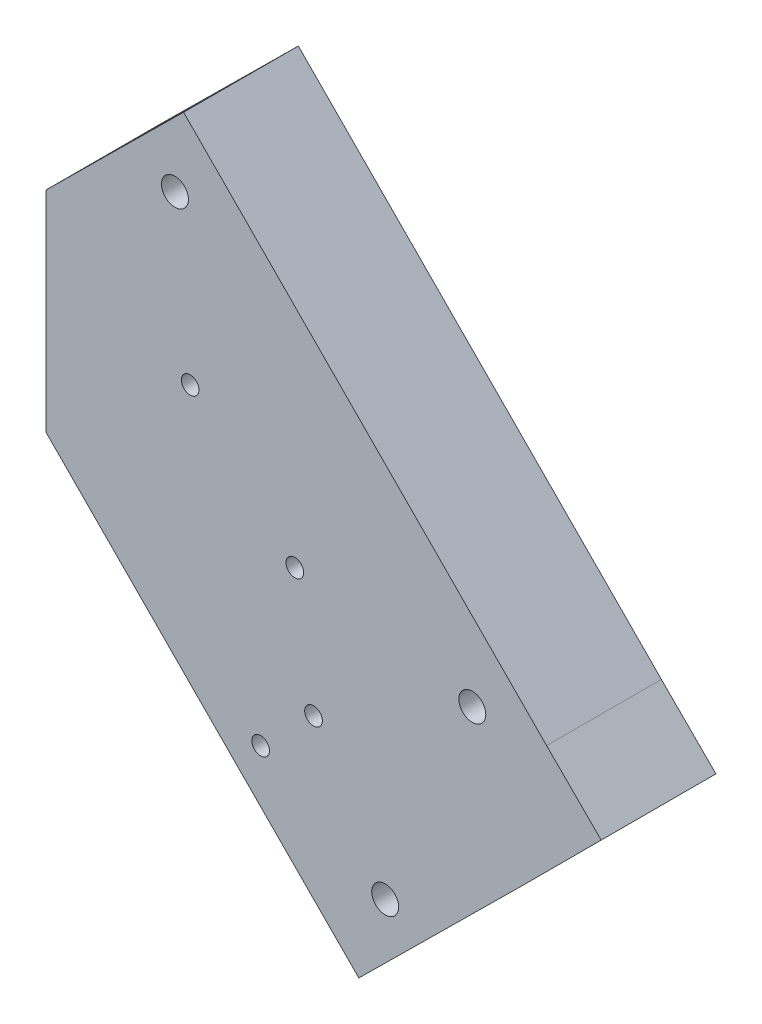
ISO-10303-21;
HEADER;
FILE_DESCRIPTION(('STEP AP214'),'2;1');
FILE_NAME('part.step','',(''),(''),'','','');
FILE_SCHEMA(('AUTOMOTIVE_DESIGN { 1 0 10303 214 1 1 1 1 }'));
ENDSEC;
DATA;
#1=APPLICATION_CONTEXT('core data for automotive mechanical design processes');
#2=APPLICATION_PROTOCOL_DEFINITION('international standard','automotive_design',2000,#1);
#3=PRODUCT_CONTEXT('',#1,'mechanical');
#4=PRODUCT('Part','Part','',(#3));
#5=PRODUCT_RELATED_PRODUCT_CATEGORY('part','',(#4));
#6=PRODUCT_DEFINITION_FORMATION('','',#4);
#7=PRODUCT_DEFINITION_CONTEXT('part definition',#1,'design');
#8=PRODUCT_DEFINITION('design','',#6,#7);
#9=PRODUCT_DEFINITION_SHAPE('','',#8);
#10=(LENGTH_UNIT() NAMED_UNIT(*) SI_UNIT(.MILLI.,.METRE.));
#11=(NAMED_UNIT(*) PLANE_ANGLE_UNIT() SI_UNIT($,.RADIAN.));
#12=(NAMED_UNIT(*) SI_UNIT($,.STERADIAN.) SOLID_ANGLE_UNIT());
#13=UNCERTAINTY_MEASURE_WITH_UNIT(LENGTH_MEASURE(1.E-05),#10,'distance_accuracy_value','');
#14=(GEOMETRIC_REPRESENTATION_CONTEXT(3) GLOBAL_UNCERTAINTY_ASSIGNED_CONTEXT((#13)) GLOBAL_UNIT_ASSIGNED_CONTEXT((#10,
#11,#12)) REPRESENTATION_CONTEXT('',''));
#15=CARTESIAN_POINT('',(0.,0.,0.));
#16=DIRECTION('',(0.,0.,1.));
#17=DIRECTION('',(1.,0.,0.));
#18=AXIS2_PLACEMENT_3D('',#15,#16,#17);
#19=CARTESIAN_POINT('',(-16.51,0.,129.532503117749));
#20=DIRECTION('',(-1.,0.,0.));
#21=DIRECTION('',(0.,0.,1.));
#22=AXIS2_PLACEMENT_3D('',#19,#20,#21);
#23=PLANE('',#22);
#24=DIRECTION('',(0.,1.,0.));
#25=VECTOR('',#24,1.);
#26=CARTESIAN_POINT('',(-16.51,0.,0.));
#27=LINE('',#26,#25);
#28=CARTESIAN_POINT('',(-16.51,3.14621411463105,0.));
#29=VERTEX_POINT('',#28);
#30=CARTESIAN_POINT('',(-16.51,30.0469418693277,0.));
#31=VERTEX_POINT('',#30);
#32=EDGE_CURVE('E163',#29,#31,#27,.T.);
#33=ORIENTED_EDGE('',*,*,#32,.F.);
#34=DIRECTION('',(0.,0.,1.));
#35=VECTOR('',#34,1.);
#36=CARTESIAN_POINT('',(-16.51,3.14621411463105,129.532503117749));
#37=LINE('',#36,#35);
#38=CARTESIAN_POINT('',(-16.51,3.14621411463105,14.7027999700007));
#39=VERTEX_POINT('',#38);
#40=EDGE_CURVE('E159',#29,#39,#37,.T.);
#41=ORIENTED_EDGE('',*,*,#40,.T.);
#42=DIRECTION('',(0.,1.,0.));
#43=VECTOR('',#42,1.);
#44=CARTESIAN_POINT('',(-16.51,0.,14.7027999700007));
#45=LINE('',#44,#43);
#46=CARTESIAN_POINT('',(-16.51,30.0469418693277,14.7027999700007));
#47=VERTEX_POINT('',#46);
#48=EDGE_CURVE('E162',#39,#47,#45,.T.);
#49=ORIENTED_EDGE('',*,*,#48,.T.);
#50=DIRECTION('',(0.,0.,1.));
#51=VECTOR('',#50,1.);
#52=CARTESIAN_POINT('',(-16.51,30.0469418693277,129.532503117749));
#53=LINE('',#52,#51);
#54=EDGE_CURVE('E157',#31,#47,#53,.T.);
#55=ORIENTED_EDGE('',*,*,#54,.F.);
#56=EDGE_LOOP('',(#33,#41,#49,#55));
#57=FACE_BOUND('',#56,.T.);
#58=ADVANCED_FACE('F17',(#57),#23,.T.);
#59=CARTESIAN_POINT('',(0.,0.,0.));
#60=DIRECTION('',(0.,0.,1.));
#61=DIRECTION('',(1.,0.,0.));
#62=AXIS2_PLACEMENT_3D('',#59,#60,#61);
#63=PLANE('',#62);
#64=CARTESIAN_POINT('',(2.65936880940541E-13,38.1,0.));
#65=DIRECTION('',(0.,0.,1.));
#66=DIRECTION('',(1.,0.,0.));
#67=AXIS2_PLACEMENT_3D('',#64,#65,#66);
#68=CIRCLE('',#67,1.7272);
#69=CARTESIAN_POINT('',(1.72720000000027,38.1,0.));
#70=VERTEX_POINT('',#69);
#71=EDGE_CURVE('E166',#70,#70,#68,.T.);
#72=ORIENTED_EDGE('',*,*,#71,.T.);
#73=EDGE_LOOP('',(#72));
#74=FACE_BOUND('',#73,.T.);
#75=CARTESIAN_POINT('',(38.0999999999975,-1.26008841324518E-13,0.));
#76=DIRECTION('',(0.,0.,1.));
#77=DIRECTION('',(1.,0.,0.));
#78=AXIS2_PLACEMENT_3D('',#75,#76,#77);
#79=CIRCLE('',#78,1.7272);
#80=CARTESIAN_POINT('',(39.8271999999975,-1.26008841324518E-13,0.));
#81=VERTEX_POINT('',#80);
#82=EDGE_CURVE('E169',#81,#81,#79,.T.);
#83=ORIENTED_EDGE('',*,*,#82,.T.);
#84=EDGE_LOOP('',(#83));
#85=FACE_BOUND('',#84,.T.);
#86=CARTESIAN_POINT('',(26.9407683632053,-26.9407683632067,0.));
#87=DIRECTION('',(0.,0.,1.));
#88=DIRECTION('',(1.,0.,0.));
#89=AXIS2_PLACEMENT_3D('',#86,#87,#88);
#90=CIRCLE('',#89,1.72719999999997);
#91=CARTESIAN_POINT('',(28.6679683632052,-26.9407683632067,0.));
#92=VERTEX_POINT('',#91);
#93=EDGE_CURVE('E172',#92,#92,#90,.T.);
#94=ORIENTED_EDGE('',*,*,#93,.T.);
#95=EDGE_LOOP('',(#94));
#96=FACE_BOUND('',#95,.T.);
#97=DIRECTION('',(0.703254513464339,-0.710938175435836,0.));
#98=VECTOR('',#97,1.);
#99=CARTESIAN_POINT('',(1.10857066830999,47.4750949371857,0.));
#100=LINE('',#99,#98);
#101=CARTESIAN_POINT('',(1.10857066830999,47.4750949371857,0.));
#102=VERTEX_POINT('',#101);
#103=CARTESIAN_POINT('',(47.6228492556575,0.452607747304518,0.));
#104=VERTEX_POINT('',#103);
#105=EDGE_CURVE('E144',#102,#104,#100,.T.);
#106=ORIENTED_EDGE('',*,*,#105,.T.);
#107=DIRECTION('',(0.707106781186557,-0.707106781186539,0.));
#108=VECTOR('',#107,1.);
#109=CARTESIAN_POINT('',(47.6228492556575,0.452607747304507,0.));
#110=LINE('',#109,#108);
#111=CARTESIAN_POINT('',(54.612214911514,-6.53675790855186,0.));
#112=VERTEX_POINT('',#111);
#113=EDGE_CURVE('E98',#104,#112,#110,.T.);
#114=ORIENTED_EDGE('',*,*,#113,.T.);
#115=DIRECTION('',(-0.707106781186539,-0.707106781186557,0.));
#116=VECTOR('',#115,1.);
#117=CARTESIAN_POINT('',(44.6908277654517,-16.4581450546145,0.));
#118=LINE('',#117,#116);
#119=CARTESIAN_POINT('',(44.6908277654517,-16.4581450546145,0.));
#120=VERTEX_POINT('',#119);
#121=EDGE_CURVE('E94',#112,#120,#118,.T.);
#122=ORIENTED_EDGE('',*,*,#121,.T.);
#123=DIRECTION('',(0.710938175435836,0.703254513464339,0.));
#124=VECTOR('',#123,1.);
#125=CARTESIAN_POINT('',(23.559505197792,-37.3610849791266,0.));
#126=LINE('',#125,#124);
#127=CARTESIAN_POINT('',(23.559505197792,-37.3610849791266,0.));
#128=VERTEX_POINT('',#127);
#129=EDGE_CURVE('E141',#128,#120,#126,.T.);
#130=ORIENTED_EDGE('',*,*,#129,.F.);
#131=DIRECTION('',(0.70325451346434,-0.710938175435836,0.));
#132=VECTOR('',#131,1.);
#133=CARTESIAN_POINT('',(-29.9595697858711,16.7427320478914,0.));
#134=LINE('',#133,#132);
#135=EDGE_CURVE('E139',#29,#128,#134,.T.);
#136=ORIENTED_EDGE('',*,*,#135,.F.);
#137=ORIENTED_EDGE('',*,*,#32,.T.);
#138=DIRECTION('',(0.710938175435836,0.70325451346434,0.));
#139=VECTOR('',#138,1.);
#140=CARTESIAN_POINT('',(-29.9595697858711,16.7427320478914,0.));
#141=LINE('',#140,#139);
#142=EDGE_CURVE('E147',#31,#102,#141,.T.);
#143=ORIENTED_EDGE('',*,*,#142,.T.);
#144=EDGE_LOOP('',(#106,#114,#122,#130,#136,#137,#143));
#145=FACE_BOUND('',#144,.T.);
#146=ADVANCED_FACE('F195',(#74,#85,#96,#145),#63,.F.);
#147=CARTESIAN_POINT('',(33.67649573755,8.86349599743227,14.7027999700008));
#148=DIRECTION('',(0.,0.,1.));
#149=DIRECTION('',(-0.703254513464339,0.710938175435836,0.));
#150=AXIS2_PLACEMENT_3D('',#147,#148,#149);
#151=PLANE('',#150);
#152=DIRECTION('',(0.710938175435836,0.703254513464339,0.));
#153=VECTOR('',#152,1.);
#154=CARTESIAN_POINT('',(23.559505197792,-37.3610849791266,14.7027999700007));
#155=LINE('',#154,#153);
#156=CARTESIAN_POINT('',(23.559505197792,-37.3610849791266,14.7027999700007));
#157=VERTEX_POINT('',#156);
#158=CARTESIAN_POINT('',(44.6908277654517,-16.4581450546145,14.7027999700008));
#159=VERTEX_POINT('',#158);
#160=EDGE_CURVE('E106',#157,#159,#155,.T.);
#161=ORIENTED_EDGE('',*,*,#160,.T.);
#162=DIRECTION('',(0.707106781186539,0.707106781186556,0.));
#163=VECTOR('',#162,1.);
#164=CARTESIAN_POINT('',(44.6908277654517,-16.4581450546145,14.7027999700007));
#165=LINE('',#164,#163);
#166=CARTESIAN_POINT('',(54.612214911514,-6.53675790855186,14.7027999700007));
#167=VERTEX_POINT('',#166);
#168=EDGE_CURVE('E92',#159,#167,#165,.T.);
#169=ORIENTED_EDGE('',*,*,#168,.T.);
#170=DIRECTION('',(-0.707106781186557,0.707106781186539,0.));
#171=VECTOR('',#170,1.);
#172=CARTESIAN_POINT('',(47.6228492556575,0.452607747304507,14.7027999700007));
#173=LINE('',#172,#171);
#174=CARTESIAN_POINT('',(47.6228492556575,0.452607747304507,14.7027999700007));
#175=VERTEX_POINT('',#174);
#176=EDGE_CURVE('E99',#167,#175,#173,.T.);
#177=ORIENTED_EDGE('',*,*,#176,.T.);
#178=DIRECTION('',(0.703254513464339,-0.710938175435836,0.));
#179=VECTOR('',#178,1.);
#180=CARTESIAN_POINT('',(1.10857066830999,47.4750949371857,14.7027999700007));
#181=LINE('',#180,#179);
#182=CARTESIAN_POINT('',(1.10857066830999,47.4750949371857,14.7027999700008));
#183=VERTEX_POINT('',#182);
#184=EDGE_CURVE('E142',#183,#175,#181,.T.);
#185=ORIENTED_EDGE('',*,*,#184,.F.);
#186=DIRECTION('',(0.710938175435836,0.70325451346434,0.));
#187=VECTOR('',#186,1.);
#188=CARTESIAN_POINT('',(-1.73518203343335,44.6620768833284,14.7027999700008));
#189=LINE('',#188,#187);
#190=EDGE_CURVE('E11',#47,#183,#189,.T.);
#191=ORIENTED_EDGE('',*,*,#190,.F.);
#192=ORIENTED_EDGE('',*,*,#48,.F.);
#193=DIRECTION('',(0.70325451346434,-0.710938175435836,0.));
#194=VECTOR('',#193,1.);
#195=CARTESIAN_POINT('',(5.45210798511224,-19.0558488380047,14.7027999700007));
#196=LINE('',#195,#194);
#197=EDGE_CURVE('E25',#39,#157,#196,.T.);
#198=ORIENTED_EDGE('',*,*,#197,.T.);
#199=EDGE_LOOP('',(#161,#169,#177,#185,#191,#192,#198));
#200=FACE_BOUND('',#199,.T.);
#201=CARTESIAN_POINT('',(17.753156923691,-11.1750395356113,14.7027999700007));
#202=DIRECTION('',(0.,0.,1.));
#203=DIRECTION('',(1.,0.,0.));
#204=AXIS2_PLACEMENT_3D('',#201,#202,#203);
#205=CIRCLE('',#204,1.13029999999999);
#206=CARTESIAN_POINT('',(18.883456923691,-11.1750395356113,14.7027999700007));
#207=VERTEX_POINT('',#206);
#208=EDGE_CURVE('E115',#207,#207,#205,.T.);
#209=ORIENTED_EDGE('',*,*,#208,.F.);
#210=EDGE_LOOP('',(#209));
#211=FACE_BOUND('',#210,.T.);
#212=CARTESIAN_POINT('',(10.9814708026647,-17.8735387763591,14.7027999700007));
#213=DIRECTION('',(0.,0.,1.));
#214=DIRECTION('',(1.,0.,0.));
#215=AXIS2_PLACEMENT_3D('',#212,#213,#214);
#216=CIRCLE('',#215,1.1303);
#217=CARTESIAN_POINT('',(12.1117708026647,-17.8735387763591,14.7027999700007));
#218=VERTEX_POINT('',#217);
#219=EDGE_CURVE('E121',#218,#218,#216,.T.);
#220=ORIENTED_EDGE('',*,*,#219,.F.);
#221=EDGE_LOOP('',(#220));
#222=FACE_BOUND('',#221,.T.);
#223=CARTESIAN_POINT('',(15.3652146717453,4.07886797903757,14.7027999700007));
#224=DIRECTION('',(0.,0.,1.));
#225=DIRECTION('',(1.,0.,0.));
#226=AXIS2_PLACEMENT_3D('',#223,#224,#225);
#227=CIRCLE('',#226,1.1303);
#228=CARTESIAN_POINT('',(16.4955146717453,4.07886797903757,14.7027999700007));
#229=VERTEX_POINT('',#228);
#230=EDGE_CURVE('E127',#229,#229,#227,.T.);
#231=ORIENTED_EDGE('',*,*,#230,.F.);
#232=EDGE_LOOP('',(#231));
#233=FACE_BOUND('',#232,.T.);
#234=CARTESIAN_POINT('',(1.95035352560764,17.6402980507463,14.7027999700007));
#235=DIRECTION('',(0.,0.,1.));
#236=DIRECTION('',(1.,0.,0.));
#237=AXIS2_PLACEMENT_3D('',#234,#235,#236);
#238=CIRCLE('',#237,1.1303);
#239=CARTESIAN_POINT('',(3.08065352560764,17.6402980507463,14.7027999700007));
#240=VERTEX_POINT('',#239);
#241=EDGE_CURVE('E133',#240,#240,#238,.T.);
#242=ORIENTED_EDGE('',*,*,#241,.F.);
#243=EDGE_LOOP('',(#242));
#244=FACE_BOUND('',#243,.T.);
#245=CARTESIAN_POINT('',(26.9407683632053,-26.9407683632067,14.7027999700007));
#246=DIRECTION('',(0.,0.,1.));
#247=DIRECTION('',(1.,0.,0.));
#248=AXIS2_PLACEMENT_3D('',#245,#246,#247);
#249=CIRCLE('',#248,1.72719999999997);
#250=CARTESIAN_POINT('',(28.6679683632052,-26.9407683632067,14.7027999700007));
#251=VERTEX_POINT('',#250);
#252=EDGE_CURVE('E175',#251,#251,#249,.T.);
#253=ORIENTED_EDGE('',*,*,#252,.F.);
#254=EDGE_LOOP('',(#253));
#255=FACE_BOUND('',#254,.T.);
#256=CARTESIAN_POINT('',(38.0999999999975,-1.26008841324518E-13,14.7027999700008));
#257=DIRECTION('',(0.,0.,1.));
#258=DIRECTION('',(1.,0.,0.));
#259=AXIS2_PLACEMENT_3D('',#256,#257,#258);
#260=CIRCLE('',#259,1.7272);
#261=CARTESIAN_POINT('',(39.8271999999975,-1.26008841324518E-13,14.7027999700008));
#262=VERTEX_POINT('',#261);
#263=EDGE_CURVE('E178',#262,#262,#260,.T.);
#264=ORIENTED_EDGE('',*,*,#263,.F.);
#265=EDGE_LOOP('',(#264));
#266=FACE_BOUND('',#265,.T.);
#267=CARTESIAN_POINT('',(2.65936880940541E-13,38.1,14.7027999700007));
#268=DIRECTION('',(0.,0.,1.));
#269=DIRECTION('',(1.,0.,0.));
#270=AXIS2_PLACEMENT_3D('',#267,#268,#269);
#271=CIRCLE('',#270,1.7272);
#272=CARTESIAN_POINT('',(1.72720000000027,38.1,14.7027999700007));
#273=VERTEX_POINT('',#272);
#274=EDGE_CURVE('E181',#273,#273,#271,.T.);
#275=ORIENTED_EDGE('',*,*,#274,.F.);
#276=EDGE_LOOP('',(#275));
#277=FACE_BOUND('',#276,.T.);
#278=ADVANCED_FACE('F19',(#200,#211,#222,#233,#244,#255,#266,#277),#151,.T.);
#279=CARTESIAN_POINT('',(2.65936880940541E-13,38.1,129.532503117749));
#280=DIRECTION('',(0.,0.,-1.));
#281=DIRECTION('',(-1.,0.,0.));
#282=AXIS2_PLACEMENT_3D('',#279,#280,#281);
#283=CYLINDRICAL_SURFACE('',#282,1.7272);
#284=ORIENTED_EDGE('',*,*,#71,.F.);
#285=EDGE_LOOP('',(#284));
#286=FACE_BOUND('',#285,.T.);
#287=ORIENTED_EDGE('',*,*,#274,.T.);
#288=EDGE_LOOP('',(#287));
#289=FACE_BOUND('',#288,.T.);
#290=ADVANCED_FACE('F229',(#286,#289),#283,.F.);
#291=CARTESIAN_POINT('',(38.0999999999975,-1.26008841324518E-13,129.532503117749));
#292=DIRECTION('',(0.,0.,-1.));
#293=DIRECTION('',(-1.,0.,0.));
#294=AXIS2_PLACEMENT_3D('',#291,#292,#293);
#295=CYLINDRICAL_SURFACE('',#294,1.7272);
#296=ORIENTED_EDGE('',*,*,#82,.F.);
#297=EDGE_LOOP('',(#296));
#298=FACE_BOUND('',#297,.T.);
#299=ORIENTED_EDGE('',*,*,#263,.T.);
#300=EDGE_LOOP('',(#299));
#301=FACE_BOUND('',#300,.T.);
#302=ADVANCED_FACE('F225',(#298,#301),#295,.F.);
#303=CARTESIAN_POINT('',(26.9407683632053,-26.9407683632067,129.532503117749));
#304=DIRECTION('',(0.,0.,-1.));
#305=DIRECTION('',(-1.,0.,0.));
#306=AXIS2_PLACEMENT_3D('',#303,#304,#305);
#307=CYLINDRICAL_SURFACE('',#306,1.72719999999997);
#308=ORIENTED_EDGE('',*,*,#93,.F.);
#309=EDGE_LOOP('',(#308));
#310=FACE_BOUND('',#309,.T.);
#311=ORIENTED_EDGE('',*,*,#252,.T.);
#312=EDGE_LOOP('',(#311));
#313=FACE_BOUND('',#312,.T.);
#314=ADVANCED_FACE('F222',(#310,#313),#307,.F.);
#315=CARTESIAN_POINT('',(23.559505197792,-37.3610849791266,0.));
#316=DIRECTION('',(0.703254513464339,-0.710938175435836,0.));
#317=DIRECTION('',(0.710938175435836,0.703254513464339,0.));
#318=AXIS2_PLACEMENT_3D('',#315,#316,#317);
#319=PLANE('',#318);
#320=DIRECTION('',(0.,0.,-1.));
#321=VECTOR('',#320,1.);
#322=CARTESIAN_POINT('',(44.6908277654517,-16.4581450546145,129.532503117749));
#323=LINE('',#322,#321);
#324=EDGE_CURVE('E39',#120,#159,#323,.F.);
#325=ORIENTED_EDGE('',*,*,#324,.T.);
#326=ORIENTED_EDGE('',*,*,#160,.F.);
#327=DIRECTION('',(0.,0.,1.));
#328=VECTOR('',#327,1.);
#329=CARTESIAN_POINT('',(23.559505197792,-37.3610849791266,0.));
#330=LINE('',#329,#328);
#331=EDGE_CURVE('E150',#128,#157,#330,.T.);
#332=ORIENTED_EDGE('',*,*,#331,.F.);
#333=ORIENTED_EDGE('',*,*,#129,.T.);
#334=EDGE_LOOP('',(#325,#326,#332,#333));
#335=FACE_BOUND('',#334,.T.);
#336=ADVANCED_FACE('F197',(#335),#319,.T.);
#337=CARTESIAN_POINT('',(-29.9595697858711,16.7427320478914,0.));
#338=DIRECTION('',(-0.710938175435836,-0.703254513464339,0.));
#339=DIRECTION('',(0.70325451346434,-0.710938175435836,0.));
#340=AXIS2_PLACEMENT_3D('',#337,#338,#339);
#341=PLANE('',#340);
#342=ORIENTED_EDGE('',*,*,#135,.T.);
#343=ORIENTED_EDGE('',*,*,#331,.T.);
#344=ORIENTED_EDGE('',*,*,#197,.F.);
#345=ORIENTED_EDGE('',*,*,#40,.F.);
#346=EDGE_LOOP('',(#342,#343,#344,#345));
#347=FACE_BOUND('',#346,.T.);
#348=ADVANCED_FACE('F188',(#347),#341,.T.);
#349=CARTESIAN_POINT('',(1.10857066830999,47.4750949371857,0.));
#350=DIRECTION('',(-0.710938175435836,-0.703254513464339,0.));
#351=DIRECTION('',(0.70325451346434,-0.710938175435836,0.));
#352=AXIS2_PLACEMENT_3D('',#349,#350,#351);
#353=PLANE('',#352);
#354=ORIENTED_EDGE('',*,*,#105,.F.);
#355=DIRECTION('',(0.,0.,1.));
#356=VECTOR('',#355,1.);
#357=CARTESIAN_POINT('',(1.10857066830999,47.4750949371857,0.));
#358=LINE('',#357,#356);
#359=EDGE_CURVE('E32',#102,#183,#358,.T.);
#360=ORIENTED_EDGE('',*,*,#359,.T.);
#361=ORIENTED_EDGE('',*,*,#184,.T.);
#362=DIRECTION('',(0.,0.,-1.));
#363=VECTOR('',#362,1.);
#364=CARTESIAN_POINT('',(47.6228492556575,0.452607747304518,129.532503117749));
#365=LINE('',#364,#363);
#366=EDGE_CURVE('E110',#104,#175,#365,.F.);
#367=ORIENTED_EDGE('',*,*,#366,.F.);
#368=EDGE_LOOP('',(#354,#360,#361,#367));
#369=FACE_BOUND('',#368,.T.);
#370=ADVANCED_FACE('F198',(#369),#353,.F.);
#371=CARTESIAN_POINT('',(-29.9595697858711,16.7427320478914,0.));
#372=DIRECTION('',(0.703254513464339,-0.710938175435836,0.));
#373=DIRECTION('',(0.710938175435836,0.70325451346434,0.));
#374=AXIS2_PLACEMENT_3D('',#371,#372,#373);
#375=PLANE('',#374);
#376=ORIENTED_EDGE('',*,*,#54,.T.);
#377=ORIENTED_EDGE('',*,*,#190,.T.);
#378=ORIENTED_EDGE('',*,*,#359,.F.);
#379=ORIENTED_EDGE('',*,*,#142,.F.);
#380=EDGE_LOOP('',(#376,#377,#378,#379));
#381=FACE_BOUND('',#380,.T.);
#382=ADVANCED_FACE('F200',(#381),#375,.F.);
#383=CARTESIAN_POINT('',(1.95035352560764,17.6402980507463,2.00279997000074));
#384=DIRECTION('',(0.,0.,1.));
#385=DIRECTION('',(1.,0.,0.));
#386=AXIS2_PLACEMENT_3D('',#383,#384,#385);
#387=CONICAL_SURFACE('',#386,1.1303,1.02974425867665);
#388=CARTESIAN_POINT('',(1.95035352560763,17.6402980507463,1.32364721231389));
#389=VERTEX_POINT('',#388);
#390=VERTEX_LOOP('',#389);
#391=FACE_BOUND('',#390,.T.);
#392=CARTESIAN_POINT('',(1.95035352560764,17.6402980507463,2.00279997000074));
#393=DIRECTION('',(0.,0.,1.));
#394=DIRECTION('',(1.,0.,0.));
#395=AXIS2_PLACEMENT_3D('',#392,#393,#394);
#396=CIRCLE('',#395,1.1303);
#397=CARTESIAN_POINT('',(3.08065352560764,17.6402980507463,2.00279997000074));
#398=VERTEX_POINT('',#397);
#399=EDGE_CURVE('E136',#398,#398,#396,.T.);
#400=ORIENTED_EDGE('',*,*,#399,.T.);
#401=EDGE_LOOP('',(#400));
#402=FACE_BOUND('',#401,.T.);
#403=ADVANCED_FACE('F202',(#391,#402),#387,.F.);
#404=CARTESIAN_POINT('',(1.95035352560764,17.6402980507463,14.7027999700007));
#405=DIRECTION('',(0.,0.,1.));
#406=DIRECTION('',(1.,0.,0.));
#407=AXIS2_PLACEMENT_3D('',#404,#405,#406);
#408=CYLINDRICAL_SURFACE('',#407,1.1303);
#409=ORIENTED_EDGE('',*,*,#399,.F.);
#410=EDGE_LOOP('',(#409));
#411=FACE_BOUND('',#410,.T.);
#412=ORIENTED_EDGE('',*,*,#241,.T.);
#413=EDGE_LOOP('',(#412));
#414=FACE_BOUND('',#413,.T.);
#415=ADVANCED_FACE('F210',(#411,#414),#408,.F.);
#416=CARTESIAN_POINT('',(15.3652146717453,4.07886797903757,2.00279997000074));
#417=DIRECTION('',(0.,0.,1.));
#418=DIRECTION('',(1.,0.,0.));
#419=AXIS2_PLACEMENT_3D('',#416,#417,#418);
#420=CONICAL_SURFACE('',#419,1.1303,1.02974425867665);
#421=CARTESIAN_POINT('',(15.3652146717453,4.07886797903757,1.32364721231389));
#422=VERTEX_POINT('',#421);
#423=VERTEX_LOOP('',#422);
#424=FACE_BOUND('',#423,.T.);
#425=CARTESIAN_POINT('',(15.3652146717453,4.07886797903757,2.00279997000074));
#426=DIRECTION('',(0.,0.,1.));
#427=DIRECTION('',(1.,0.,0.));
#428=AXIS2_PLACEMENT_3D('',#425,#426,#427);
#429=CIRCLE('',#428,1.1303);
#430=CARTESIAN_POINT('',(16.4955146717453,4.07886797903757,2.00279997000074));
#431=VERTEX_POINT('',#430);
#432=EDGE_CURVE('E130',#431,#431,#429,.T.);
#433=ORIENTED_EDGE('',*,*,#432,.T.);
#434=EDGE_LOOP('',(#433));
#435=FACE_BOUND('',#434,.T.);
#436=ADVANCED_FACE('F276',(#424,#435),#420,.F.);
#437=CARTESIAN_POINT('',(15.3652146717453,4.07886797903757,14.7027999700007));
#438=DIRECTION('',(0.,0.,1.));
#439=DIRECTION('',(1.,0.,0.));
#440=AXIS2_PLACEMENT_3D('',#437,#438,#439);
#441=CYLINDRICAL_SURFACE('',#440,1.1303);
#442=ORIENTED_EDGE('',*,*,#432,.F.);
#443=EDGE_LOOP('',(#442));
#444=FACE_BOUND('',#443,.T.);
#445=ORIENTED_EDGE('',*,*,#230,.T.);
#446=EDGE_LOOP('',(#445));
#447=FACE_BOUND('',#446,.T.);
#448=ADVANCED_FACE('F288',(#444,#447),#441,.F.);
#449=CARTESIAN_POINT('',(10.9814708026647,-17.8735387763591,2.00279997000074));
#450=DIRECTION('',(0.,0.,1.));
#451=DIRECTION('',(1.,0.,0.));
#452=AXIS2_PLACEMENT_3D('',#449,#450,#451);
#453=CONICAL_SURFACE('',#452,1.1303,1.02974425867665);
#454=CARTESIAN_POINT('',(10.9814708026647,-17.8735387763591,1.32364721231389));
#455=VERTEX_POINT('',#454);
#456=VERTEX_LOOP('',#455);
#457=FACE_BOUND('',#456,.T.);
#458=CARTESIAN_POINT('',(10.9814708026647,-17.8735387763591,2.00279997000074));
#459=DIRECTION('',(0.,0.,1.));
#460=DIRECTION('',(1.,0.,0.));
#461=AXIS2_PLACEMENT_3D('',#458,#459,#460);
#462=CIRCLE('',#461,1.1303);
#463=CARTESIAN_POINT('',(12.1117708026647,-17.8735387763591,2.00279997000074));
#464=VERTEX_POINT('',#463);
#465=EDGE_CURVE('E124',#464,#464,#462,.T.);
#466=ORIENTED_EDGE('',*,*,#465,.T.);
#467=EDGE_LOOP('',(#466));
#468=FACE_BOUND('',#467,.T.);
#469=ADVANCED_FACE('F298',(#457,#468),#453,.F.);
#470=CARTESIAN_POINT('',(10.9814708026647,-17.8735387763591,14.7027999700007));
#471=DIRECTION('',(0.,0.,1.));
#472=DIRECTION('',(1.,0.,0.));
#473=AXIS2_PLACEMENT_3D('',#470,#471,#472);
#474=CYLINDRICAL_SURFACE('',#473,1.1303);
#475=ORIENTED_EDGE('',*,*,#465,.F.);
#476=EDGE_LOOP('',(#475));
#477=FACE_BOUND('',#476,.T.);
#478=ORIENTED_EDGE('',*,*,#219,.T.);
#479=EDGE_LOOP('',(#478));
#480=FACE_BOUND('',#479,.T.);
#481=ADVANCED_FACE('F309',(#477,#480),#474,.F.);
#482=CARTESIAN_POINT('',(17.753156923691,-11.1750395356113,2.00279997000074));
#483=DIRECTION('',(0.,0.,1.));
#484=DIRECTION('',(1.,0.,0.));
#485=AXIS2_PLACEMENT_3D('',#482,#483,#484);
#486=CONICAL_SURFACE('',#485,1.1303,1.02974425867665);
#487=CARTESIAN_POINT('',(17.753156923691,-11.1750395356113,1.32364721231389));
#488=VERTEX_POINT('',#487);
#489=VERTEX_LOOP('',#488);
#490=FACE_BOUND('',#489,.T.);
#491=CARTESIAN_POINT('',(17.753156923691,-11.1750395356113,2.00279997000074));
#492=DIRECTION('',(0.,0.,1.));
#493=DIRECTION('',(1.,0.,0.));
#494=AXIS2_PLACEMENT_3D('',#491,#492,#493);
#495=CIRCLE('',#494,1.1303);
#496=CARTESIAN_POINT('',(18.883456923691,-11.1750395356113,2.00279997000074));
#497=VERTEX_POINT('',#496);
#498=EDGE_CURVE('E118',#497,#497,#495,.T.);
#499=ORIENTED_EDGE('',*,*,#498,.T.);
#500=EDGE_LOOP('',(#499));
#501=FACE_BOUND('',#500,.T.);
#502=ADVANCED_FACE('F319',(#490,#501),#486,.F.);
#503=CARTESIAN_POINT('',(17.753156923691,-11.1750395356113,14.7027999700007));
#504=DIRECTION('',(0.,0.,1.));
#505=DIRECTION('',(1.,0.,0.));
#506=AXIS2_PLACEMENT_3D('',#503,#504,#505);
#507=CYLINDRICAL_SURFACE('',#506,1.1303);
#508=ORIENTED_EDGE('',*,*,#498,.F.);
#509=EDGE_LOOP('',(#508));
#510=FACE_BOUND('',#509,.T.);
#511=ORIENTED_EDGE('',*,*,#208,.T.);
#512=EDGE_LOOP('',(#511));
#513=FACE_BOUND('',#512,.T.);
#514=ADVANCED_FACE('F330',(#510,#513),#507,.F.);
#515=CARTESIAN_POINT('',(47.6228492556575,0.452607747304507,-19.6063123312279));
#516=DIRECTION('',(0.707106781186538,0.707106781186557,0.));
#517=DIRECTION('',(-0.707106781186557,0.707106781186539,0.));
#518=AXIS2_PLACEMENT_3D('',#515,#516,#517);
#519=PLANE('',#518);
#520=ORIENTED_EDGE('',*,*,#113,.F.);
#521=ORIENTED_EDGE('',*,*,#366,.T.);
#522=ORIENTED_EDGE('',*,*,#176,.F.);
#523=DIRECTION('',(0.,0.,1.));
#524=VECTOR('',#523,1.);
#525=CARTESIAN_POINT('',(54.612214911514,-6.53675790855186,-19.6063123312279));
#526=LINE('',#525,#524);
#527=EDGE_CURVE('E89',#112,#167,#526,.T.);
#528=ORIENTED_EDGE('',*,*,#527,.F.);
#529=EDGE_LOOP('',(#520,#521,#522,#528));
#530=FACE_BOUND('',#529,.T.);
#531=ADVANCED_FACE('F109',(#530),#519,.T.);
#532=CARTESIAN_POINT('',(44.6908277654517,-16.4581450546145,-19.6063123312279));
#533=DIRECTION('',(0.707106781186557,-0.707106781186539,0.));
#534=DIRECTION('',(0.707106781186539,0.707106781186557,0.));
#535=AXIS2_PLACEMENT_3D('',#532,#533,#534);
#536=PLANE('',#535);
#537=ORIENTED_EDGE('',*,*,#121,.F.);
#538=ORIENTED_EDGE('',*,*,#527,.T.);
#539=ORIENTED_EDGE('',*,*,#168,.F.);
#540=ORIENTED_EDGE('',*,*,#324,.F.);
#541=EDGE_LOOP('',(#537,#538,#539,#540));
#542=FACE_BOUND('',#541,.T.);
#543=ADVANCED_FACE('F91',(#542),#536,.T.);
#544=CLOSED_SHELL('',(#58,#146,#278,#290,#302,#314,#336,#348,#370,#382,#403,#415,#436,#448,#469,
#481,#502,#514,#531,#543));
#545=MANIFOLD_SOLID_BREP('B1',#544);
#546=ADVANCED_BREP_SHAPE_REPRESENTATION('',(#18,#545),#14);
#547=SHAPE_DEFINITION_REPRESENTATION(#9,#546);
ENDSEC;
END-ISO-10303-21;
